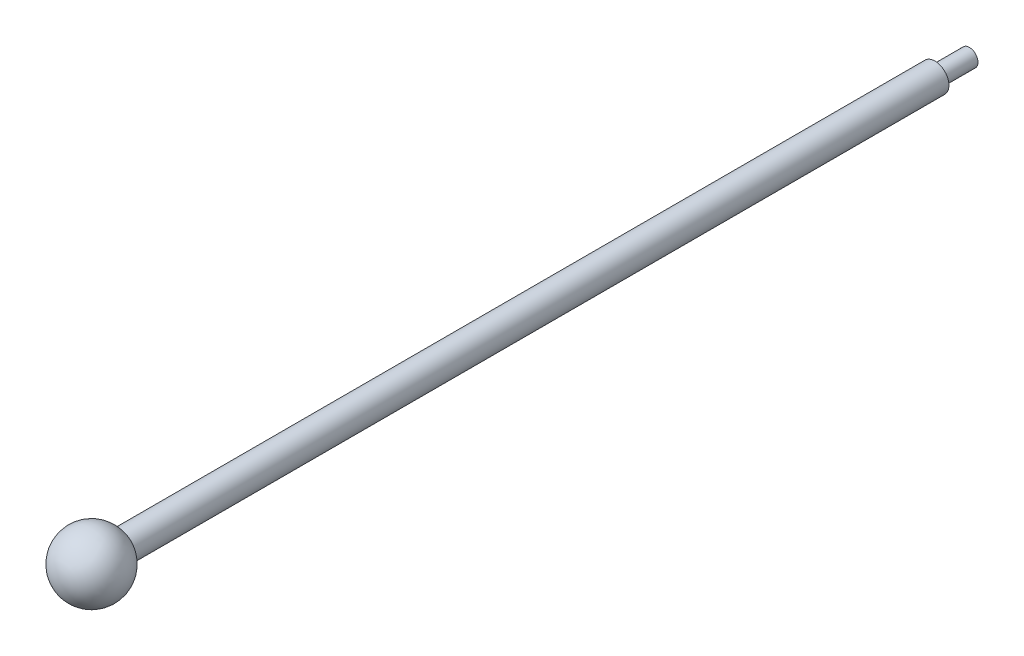
ISO-10303-21;
HEADER;
FILE_DESCRIPTION(('STEP AP214'),'2;1');
FILE_NAME('part.step','',(''),(''),'','','');
FILE_SCHEMA(('AUTOMOTIVE_DESIGN { 1 0 10303 214 1 1 1 1 }'));
ENDSEC;
DATA;
#1=APPLICATION_CONTEXT('core data for automotive mechanical design processes');
#2=APPLICATION_PROTOCOL_DEFINITION('international standard','automotive_design',2000,#1);
#3=PRODUCT_CONTEXT('',#1,'mechanical');
#4=PRODUCT('Part','Part','',(#3));
#5=PRODUCT_RELATED_PRODUCT_CATEGORY('part','',(#4));
#6=PRODUCT_DEFINITION_FORMATION('','',#4);
#7=PRODUCT_DEFINITION_CONTEXT('part definition',#1,'design');
#8=PRODUCT_DEFINITION('design','',#6,#7);
#9=PRODUCT_DEFINITION_SHAPE('','',#8);
#10=(LENGTH_UNIT() NAMED_UNIT(*) SI_UNIT(.MILLI.,.METRE.));
#11=(NAMED_UNIT(*) PLANE_ANGLE_UNIT() SI_UNIT($,.RADIAN.));
#12=(NAMED_UNIT(*) SI_UNIT($,.STERADIAN.) SOLID_ANGLE_UNIT());
#13=UNCERTAINTY_MEASURE_WITH_UNIT(LENGTH_MEASURE(1.E-05),#10,'distance_accuracy_value','');
#14=(GEOMETRIC_REPRESENTATION_CONTEXT(3) GLOBAL_UNCERTAINTY_ASSIGNED_CONTEXT((#13)) GLOBAL_UNIT_ASSIGNED_CONTEXT((#10,
#11,#12)) REPRESENTATION_CONTEXT('',''));
#15=CARTESIAN_POINT('',(0.,0.,0.));
#16=DIRECTION('',(0.,0.,1.));
#17=DIRECTION('',(1.,0.,0.));
#18=AXIS2_PLACEMENT_3D('',#15,#16,#17);
#19=CARTESIAN_POINT('',(0.,0.,0.));
#20=DIRECTION('',(0.,1.,0.));
#21=DIRECTION('',(1.,0.,0.));
#22=AXIS2_PLACEMENT_3D('',#19,#20,#21);
#23=SPHERICAL_SURFACE('',#22,15.);
#24=CARTESIAN_POINT('',(0.,0.,0.));
#25=DIRECTION('',(0.,0.,1.));
#26=DIRECTION('',(1.,0.,0.));
#27=AXIS2_PLACEMENT_3D('',#24,#25,#26);
#28=SPHERICAL_SURFACE('',#27,15.);
#29=CARTESIAN_POINT('',(0.,0.,-13.5185058345958));
#30=DIRECTION('',(0.,0.,1.));
#31=DIRECTION('',(1.,0.,0.));
#32=AXIS2_PLACEMENT_3D('',#29,#30,#31);
#33=CIRCLE('',#32,6.5);
#34=CARTESIAN_POINT('',(6.5,0.,-13.5185058345958));
#35=VERTEX_POINT('',#34);
#36=EDGE_CURVE('E40',#35,#35,#33,.F.);
#37=ORIENTED_EDGE('',*,*,#36,.F.);
#38=EDGE_LOOP('',(#37));
#39=FACE_BOUND('',#38,.T.);
#40=ADVANCED_FACE('F37',(#39),#28,.T.);
#41=CARTESIAN_POINT('',(0.,0.,15.002));
#42=DIRECTION('',(0.,0.,-1.));
#43=DIRECTION('',(-1.,0.,0.));
#44=AXIS2_PLACEMENT_3D('',#41,#42,#43);
#45=CYLINDRICAL_SURFACE('',#44,6.5);
#46=ORIENTED_EDGE('',*,*,#36,.T.);
#47=EDGE_LOOP('',(#46));
#48=FACE_BOUND('',#47,.T.);
#49=CARTESIAN_POINT('',(0.,0.,-391.5));
#50=DIRECTION('',(0.,0.,-1.));
#51=DIRECTION('',(-1.,0.,0.));
#52=AXIS2_PLACEMENT_3D('',#49,#50,#51);
#53=CIRCLE('',#52,6.5);
#54=CARTESIAN_POINT('',(-6.5,0.,-391.5));
#55=VERTEX_POINT('',#54);
#56=EDGE_CURVE('E50',#55,#55,#53,.T.);
#57=ORIENTED_EDGE('',*,*,#56,.F.);
#58=EDGE_LOOP('',(#57));
#59=FACE_BOUND('',#58,.T.);
#60=ADVANCED_FACE('F72',(#48,#59),#45,.T.);
#61=CARTESIAN_POINT('',(0.,0.,-391.5));
#62=DIRECTION('',(0.,0.,-1.));
#63=DIRECTION('',(-1.,0.,0.));
#64=AXIS2_PLACEMENT_3D('',#61,#62,#63);
#65=PLANE('',#64);
#66=CARTESIAN_POINT('',(0.,0.,-391.5));
#67=DIRECTION('',(0.,0.,-1.));
#68=DIRECTION('',(-1.,0.,0.));
#69=AXIS2_PLACEMENT_3D('',#66,#67,#68);
#70=CIRCLE('',#69,4.);
#71=CARTESIAN_POINT('',(-4.,0.,-391.5));
#72=VERTEX_POINT('',#71);
#73=EDGE_CURVE('E10',#72,#72,#70,.T.);
#74=ORIENTED_EDGE('',*,*,#73,.F.);
#75=EDGE_LOOP('',(#74));
#76=FACE_BOUND('',#75,.T.);
#77=ORIENTED_EDGE('',*,*,#56,.T.);
#78=EDGE_LOOP('',(#77));
#79=FACE_BOUND('',#78,.T.);
#80=ADVANCED_FACE('F65',(#76,#79),#65,.T.);
#81=CARTESIAN_POINT('',(0.,0.,-407.5));
#82=DIRECTION('',(0.,0.,1.));
#83=DIRECTION('',(1.,0.,0.));
#84=AXIS2_PLACEMENT_3D('',#81,#82,#83);
#85=CYLINDRICAL_SURFACE('',#84,4.);
#86=CARTESIAN_POINT('',(0.,0.,-407.5));
#87=DIRECTION('',(0.,0.,-1.));
#88=DIRECTION('',(-1.,0.,0.));
#89=AXIS2_PLACEMENT_3D('',#86,#87,#88);
#90=CIRCLE('',#89,4.);
#91=CARTESIAN_POINT('',(-4.,0.,-407.5));
#92=VERTEX_POINT('',#91);
#93=EDGE_CURVE('E52',#92,#92,#90,.T.);
#94=ORIENTED_EDGE('',*,*,#93,.F.);
#95=EDGE_LOOP('',(#94));
#96=FACE_BOUND('',#95,.T.);
#97=ORIENTED_EDGE('',*,*,#73,.T.);
#98=EDGE_LOOP('',(#97));
#99=FACE_BOUND('',#98,.T.);
#100=ADVANCED_FACE('F63',(#96,#99),#85,.T.);
#101=CARTESIAN_POINT('',(0.,0.,-407.5));
#102=DIRECTION('',(0.,0.,-1.));
#103=DIRECTION('',(-1.,0.,0.));
#104=AXIS2_PLACEMENT_3D('',#101,#102,#103);
#105=PLANE('',#104);
#106=ORIENTED_EDGE('',*,*,#93,.T.);
#107=EDGE_LOOP('',(#106));
#108=FACE_BOUND('',#107,.T.);
#109=ADVANCED_FACE('F61',(#108),#105,.T.);
#110=CLOSED_SHELL('',(#40,#60,#80,#100,#109));
#111=MANIFOLD_SOLID_BREP('B2',#110);
#112=ADVANCED_BREP_SHAPE_REPRESENTATION('',(#18,#111),#14);
#113=SHAPE_DEFINITION_REPRESENTATION(#9,#112);
ENDSEC;
END-ISO-10303-21;
